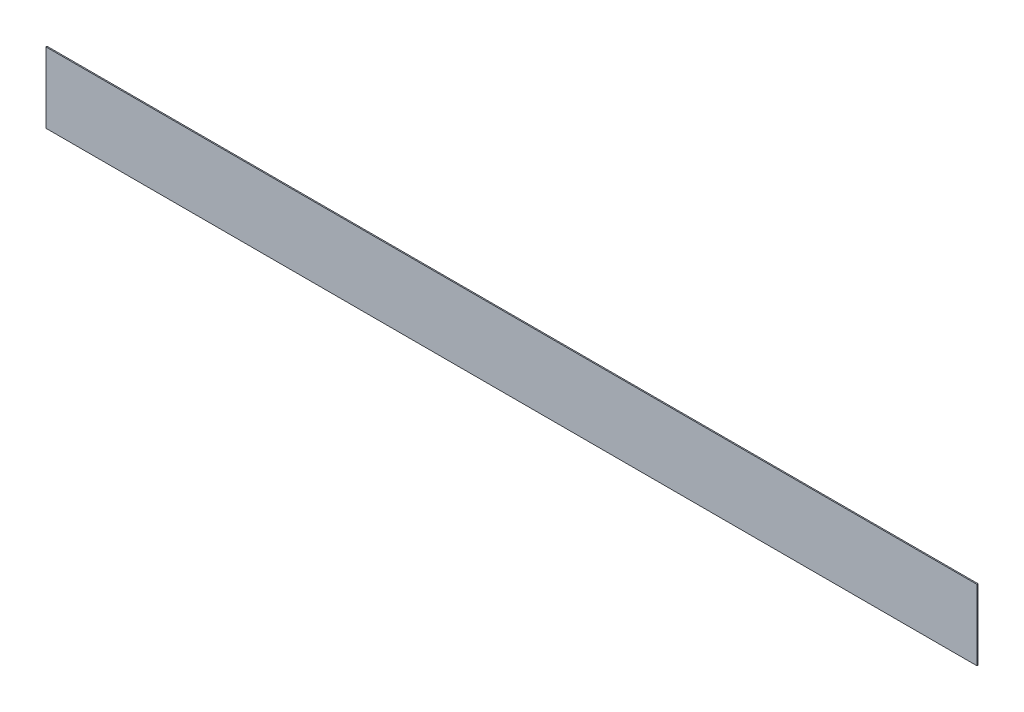
ISO-10303-21;
HEADER;
FILE_DESCRIPTION(('STEP AP214'),'2;1');
FILE_NAME('part.step','',(''),(''),'','','');
FILE_SCHEMA(('AUTOMOTIVE_DESIGN { 1 0 10303 214 1 1 1 1 }'));
ENDSEC;
DATA;
#1=APPLICATION_CONTEXT('core data for automotive mechanical design processes');
#2=APPLICATION_PROTOCOL_DEFINITION('international standard','automotive_design',2000,#1);
#3=PRODUCT_CONTEXT('',#1,'mechanical');
#4=PRODUCT('Part','Part','',(#3));
#5=PRODUCT_RELATED_PRODUCT_CATEGORY('part','',(#4));
#6=PRODUCT_DEFINITION_FORMATION('','',#4);
#7=PRODUCT_DEFINITION_CONTEXT('part definition',#1,'design');
#8=PRODUCT_DEFINITION('design','',#6,#7);
#9=PRODUCT_DEFINITION_SHAPE('','',#8);
#10=(LENGTH_UNIT() NAMED_UNIT(*) SI_UNIT(.MILLI.,.METRE.));
#11=(NAMED_UNIT(*) PLANE_ANGLE_UNIT() SI_UNIT($,.RADIAN.));
#12=(NAMED_UNIT(*) SI_UNIT($,.STERADIAN.) SOLID_ANGLE_UNIT());
#13=UNCERTAINTY_MEASURE_WITH_UNIT(LENGTH_MEASURE(1.E-05),#10,'distance_accuracy_value','');
#14=(GEOMETRIC_REPRESENTATION_CONTEXT(3) GLOBAL_UNCERTAINTY_ASSIGNED_CONTEXT((#13)) GLOBAL_UNIT_ASSIGNED_CONTEXT((#10,
#11,#12)) REPRESENTATION_CONTEXT('',''));
#15=CARTESIAN_POINT('',(0.,0.,0.));
#16=DIRECTION('',(0.,0.,1.));
#17=DIRECTION('',(1.,0.,0.));
#18=AXIS2_PLACEMENT_3D('',#15,#16,#17);
#19=CARTESIAN_POINT('',(-1650.,-745.,1754.));
#20=DIRECTION('',(0.,0.,1.));
#21=DIRECTION('',(1.,0.,0.));
#22=AXIS2_PLACEMENT_3D('',#19,#20,#21);
#23=PLANE('',#22);
#24=DIRECTION('',(1.,0.,0.));
#25=VECTOR('',#24,1.);
#26=CARTESIAN_POINT('',(-1650.,-495.,1754.));
#27=LINE('',#26,#25);
#28=CARTESIAN_POINT('',(-1650.,-495.,1754.));
#29=VERTEX_POINT('',#28);
#30=CARTESIAN_POINT('',(1650.,-495.,1754.));
#31=VERTEX_POINT('',#30);
#32=EDGE_CURVE('E101',#29,#31,#27,.T.);
#33=ORIENTED_EDGE('',*,*,#32,.F.);
#34=DIRECTION('',(0.,1.,0.));
#35=VECTOR('',#34,1.);
#36=CARTESIAN_POINT('',(-1650.,-745.,1754.));
#37=LINE('',#36,#35);
#38=CARTESIAN_POINT('',(-1650.,-745.,1754.));
#39=VERTEX_POINT('',#38);
#40=EDGE_CURVE('E11',#39,#29,#37,.T.);
#41=ORIENTED_EDGE('',*,*,#40,.F.);
#42=DIRECTION('',(1.,0.,0.));
#43=VECTOR('',#42,1.);
#44=CARTESIAN_POINT('',(-1650.,-745.,1754.));
#45=LINE('',#44,#43);
#46=CARTESIAN_POINT('',(1650.,-745.,1754.));
#47=VERTEX_POINT('',#46);
#48=EDGE_CURVE('E96',#39,#47,#45,.T.);
#49=ORIENTED_EDGE('',*,*,#48,.T.);
#50=DIRECTION('',(0.,1.,0.));
#51=VECTOR('',#50,1.);
#52=CARTESIAN_POINT('',(1650.,-745.,1754.));
#53=LINE('',#52,#51);
#54=EDGE_CURVE('E39',#47,#31,#53,.T.);
#55=ORIENTED_EDGE('',*,*,#54,.T.);
#56=EDGE_LOOP('',(#33,#41,#49,#55));
#57=FACE_BOUND('',#56,.T.);
#58=ADVANCED_FACE('F36',(#57),#23,.T.);
#59=CARTESIAN_POINT('',(-1650.,-745.,1754.));
#60=DIRECTION('',(1.,0.,0.));
#61=DIRECTION('',(0.,0.,-1.));
#62=AXIS2_PLACEMENT_3D('',#59,#60,#61);
#63=PLANE('',#62);
#64=DIRECTION('',(0.,0.,-1.));
#65=VECTOR('',#64,1.);
#66=CARTESIAN_POINT('',(-1650.,-495.,1754.));
#67=LINE('',#66,#65);
#68=CARTESIAN_POINT('',(-1650.,-495.,1750.));
#69=VERTEX_POINT('',#68);
#70=EDGE_CURVE('E69',#29,#69,#67,.T.);
#71=ORIENTED_EDGE('',*,*,#70,.T.);
#72=DIRECTION('',(0.,1.,0.));
#73=VECTOR('',#72,1.);
#74=CARTESIAN_POINT('',(-1650.,-745.,1750.));
#75=LINE('',#74,#73);
#76=CARTESIAN_POINT('',(-1650.,-745.,1750.));
#77=VERTEX_POINT('',#76);
#78=EDGE_CURVE('E45',#77,#69,#75,.T.);
#79=ORIENTED_EDGE('',*,*,#78,.F.);
#80=DIRECTION('',(0.,0.,-1.));
#81=VECTOR('',#80,1.);
#82=CARTESIAN_POINT('',(-1650.,-745.,1754.));
#83=LINE('',#82,#81);
#84=EDGE_CURVE('E84',#39,#77,#83,.T.);
#85=ORIENTED_EDGE('',*,*,#84,.F.);
#86=ORIENTED_EDGE('',*,*,#40,.T.);
#87=EDGE_LOOP('',(#71,#79,#85,#86));
#88=FACE_BOUND('',#87,.T.);
#89=ADVANCED_FACE('F111',(#88),#63,.F.);
#90=CARTESIAN_POINT('',(-1650.,-745.,1750.));
#91=DIRECTION('',(0.,0.,1.));
#92=DIRECTION('',(1.,0.,0.));
#93=AXIS2_PLACEMENT_3D('',#90,#91,#92);
#94=PLANE('',#93);
#95=DIRECTION('',(1.,0.,0.));
#96=VECTOR('',#95,1.);
#97=CARTESIAN_POINT('',(-1650.,-495.,1750.));
#98=LINE('',#97,#96);
#99=CARTESIAN_POINT('',(1650.,-495.,1750.));
#100=VERTEX_POINT('',#99);
#101=EDGE_CURVE('E91',#69,#100,#98,.T.);
#102=ORIENTED_EDGE('',*,*,#101,.T.);
#103=DIRECTION('',(0.,1.,0.));
#104=VECTOR('',#103,1.);
#105=CARTESIAN_POINT('',(1650.,-745.,1750.));
#106=LINE('',#105,#104);
#107=CARTESIAN_POINT('',(1650.,-745.,1750.));
#108=VERTEX_POINT('',#107);
#109=EDGE_CURVE('E88',#108,#100,#106,.T.);
#110=ORIENTED_EDGE('',*,*,#109,.F.);
#111=DIRECTION('',(1.,0.,0.));
#112=VECTOR('',#111,1.);
#113=CARTESIAN_POINT('',(-1650.,-745.,1750.));
#114=LINE('',#113,#112);
#115=EDGE_CURVE('E81',#77,#108,#114,.T.);
#116=ORIENTED_EDGE('',*,*,#115,.F.);
#117=ORIENTED_EDGE('',*,*,#78,.T.);
#118=EDGE_LOOP('',(#102,#110,#116,#117));
#119=FACE_BOUND('',#118,.T.);
#120=ADVANCED_FACE('F89',(#119),#94,.F.);
#121=CARTESIAN_POINT('',(1650.,-745.,1750.));
#122=DIRECTION('',(-1.,0.,0.));
#123=DIRECTION('',(0.,0.,1.));
#124=AXIS2_PLACEMENT_3D('',#121,#122,#123);
#125=PLANE('',#124);
#126=DIRECTION('',(0.,0.,1.));
#127=VECTOR('',#126,1.);
#128=CARTESIAN_POINT('',(1650.,-495.,1750.));
#129=LINE('',#128,#127);
#130=EDGE_CURVE('E104',#100,#31,#129,.T.);
#131=ORIENTED_EDGE('',*,*,#130,.T.);
#132=ORIENTED_EDGE('',*,*,#54,.F.);
#133=DIRECTION('',(0.,0.,1.));
#134=VECTOR('',#133,1.);
#135=CARTESIAN_POINT('',(1650.,-745.,1750.));
#136=LINE('',#135,#134);
#137=EDGE_CURVE('E78',#108,#47,#136,.T.);
#138=ORIENTED_EDGE('',*,*,#137,.F.);
#139=ORIENTED_EDGE('',*,*,#109,.T.);
#140=EDGE_LOOP('',(#131,#132,#138,#139));
#141=FACE_BOUND('',#140,.T.);
#142=ADVANCED_FACE('F95',(#141),#125,.F.);
#143=CARTESIAN_POINT('',(0.,-745.,0.));
#144=DIRECTION('',(0.,-1.,0.));
#145=DIRECTION('',(-1.,0.,0.));
#146=AXIS2_PLACEMENT_3D('',#143,#144,#145);
#147=PLANE('',#146);
#148=ORIENTED_EDGE('',*,*,#48,.F.);
#149=ORIENTED_EDGE('',*,*,#84,.T.);
#150=ORIENTED_EDGE('',*,*,#115,.T.);
#151=ORIENTED_EDGE('',*,*,#137,.T.);
#152=EDGE_LOOP('',(#148,#149,#150,#151));
#153=FACE_BOUND('',#152,.T.);
#154=ADVANCED_FACE('F83',(#153),#147,.T.);
#155=CARTESIAN_POINT('',(0.,-495.,0.));
#156=DIRECTION('',(0.,-1.,0.));
#157=DIRECTION('',(-1.,0.,0.));
#158=AXIS2_PLACEMENT_3D('',#155,#156,#157);
#159=PLANE('',#158);
#160=ORIENTED_EDGE('',*,*,#32,.T.);
#161=ORIENTED_EDGE('',*,*,#130,.F.);
#162=ORIENTED_EDGE('',*,*,#101,.F.);
#163=ORIENTED_EDGE('',*,*,#70,.F.);
#164=EDGE_LOOP('',(#160,#161,#162,#163));
#165=FACE_BOUND('',#164,.T.);
#166=ADVANCED_FACE('F109',(#165),#159,.F.);
#167=CLOSED_SHELL('',(#58,#89,#120,#142,#154,#166));
#168=MANIFOLD_SOLID_BREP('B2',#167);
#169=ADVANCED_BREP_SHAPE_REPRESENTATION('',(#18,#168),#14);
#170=SHAPE_DEFINITION_REPRESENTATION(#9,#169);
ENDSEC;
END-ISO-10303-21;
